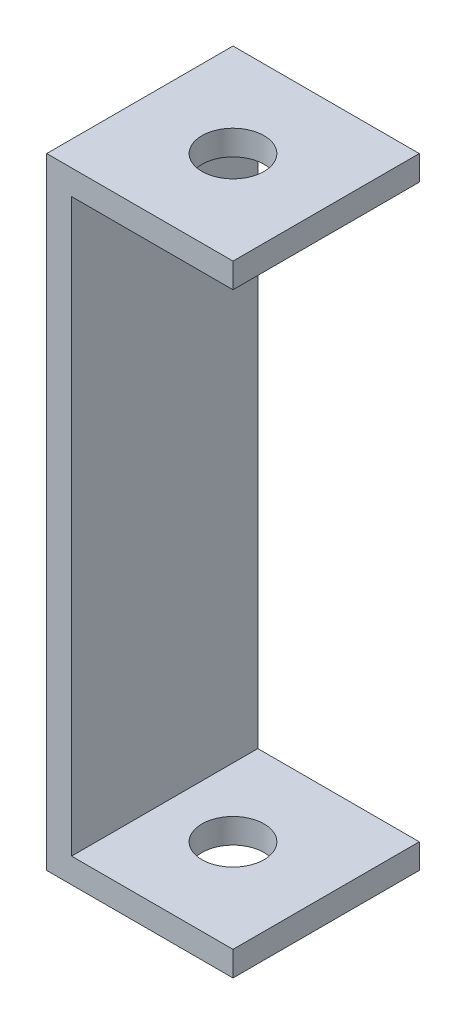
ISO-10303-21;
HEADER;
FILE_DESCRIPTION(('STEP AP214'),'2;1');
FILE_NAME('part.step','',(''),(''),'','','');
FILE_SCHEMA(('AUTOMOTIVE_DESIGN { 1 0 10303 214 1 1 1 1 }'));
ENDSEC;
DATA;
#1=APPLICATION_CONTEXT('core data for automotive mechanical design processes');
#2=APPLICATION_PROTOCOL_DEFINITION('international standard','automotive_design',2000,#1);
#3=PRODUCT_CONTEXT('',#1,'mechanical');
#4=PRODUCT('Part','Part','',(#3));
#5=PRODUCT_RELATED_PRODUCT_CATEGORY('part','',(#4));
#6=PRODUCT_DEFINITION_FORMATION('','',#4);
#7=PRODUCT_DEFINITION_CONTEXT('part definition',#1,'design');
#8=PRODUCT_DEFINITION('design','',#6,#7);
#9=PRODUCT_DEFINITION_SHAPE('','',#8);
#10=(LENGTH_UNIT() NAMED_UNIT(*) SI_UNIT(.MILLI.,.METRE.));
#11=(NAMED_UNIT(*) PLANE_ANGLE_UNIT() SI_UNIT($,.RADIAN.));
#12=(NAMED_UNIT(*) SI_UNIT($,.STERADIAN.) SOLID_ANGLE_UNIT());
#13=UNCERTAINTY_MEASURE_WITH_UNIT(LENGTH_MEASURE(1.E-05),#10,'distance_accuracy_value','');
#14=(GEOMETRIC_REPRESENTATION_CONTEXT(3) GLOBAL_UNCERTAINTY_ASSIGNED_CONTEXT((#13)) GLOBAL_UNIT_ASSIGNED_CONTEXT((#10,
#11,#12)) REPRESENTATION_CONTEXT('',''));
#15=CARTESIAN_POINT('',(0.,0.,0.));
#16=DIRECTION('',(0.,0.,1.));
#17=DIRECTION('',(1.,0.,0.));
#18=AXIS2_PLACEMENT_3D('',#15,#16,#17);
#19=CARTESIAN_POINT('',(15.,2.,15.));
#20=DIRECTION('',(-1.,0.,0.));
#21=DIRECTION('',(0.,0.,1.));
#22=AXIS2_PLACEMENT_3D('',#19,#20,#21);
#23=PLANE('',#22);
#24=DIRECTION('',(0.,1.,0.));
#25=VECTOR('',#24,1.);
#26=CARTESIAN_POINT('',(15.,2.,0.));
#27=LINE('',#26,#25);
#28=CARTESIAN_POINT('',(15.,0.,0.));
#29=VERTEX_POINT('',#28);
#30=CARTESIAN_POINT('',(15.,2.,0.));
#31=VERTEX_POINT('',#30);
#32=EDGE_CURVE('E144',#29,#31,#27,.T.);
#33=ORIENTED_EDGE('',*,*,#32,.T.);
#34=DIRECTION('',(0.,0.,-1.));
#35=VECTOR('',#34,1.);
#36=CARTESIAN_POINT('',(15.,2.,15.));
#37=LINE('',#36,#35);
#38=CARTESIAN_POINT('',(15.,2.,15.));
#39=VERTEX_POINT('',#38);
#40=EDGE_CURVE('E11',#39,#31,#37,.T.);
#41=ORIENTED_EDGE('',*,*,#40,.F.);
#42=DIRECTION('',(0.,1.,0.));
#43=VECTOR('',#42,1.);
#44=CARTESIAN_POINT('',(15.,2.,15.));
#45=LINE('',#44,#43);
#46=CARTESIAN_POINT('',(15.,0.,15.));
#47=VERTEX_POINT('',#46);
#48=EDGE_CURVE('E167',#47,#39,#45,.T.);
#49=ORIENTED_EDGE('',*,*,#48,.F.);
#50=DIRECTION('',(0.,0.,-1.));
#51=VECTOR('',#50,1.);
#52=CARTESIAN_POINT('',(15.,0.,15.));
#53=LINE('',#52,#51);
#54=EDGE_CURVE('E140',#47,#29,#53,.T.);
#55=ORIENTED_EDGE('',*,*,#54,.T.);
#56=EDGE_LOOP('',(#33,#41,#49,#55));
#57=FACE_BOUND('',#56,.T.);
#58=ADVANCED_FACE('F43',(#57),#23,.F.);
#59=CARTESIAN_POINT('',(2.00000000000001,2.,15.));
#60=DIRECTION('',(0.,-1.,0.));
#61=DIRECTION('',(1.,0.,0.));
#62=AXIS2_PLACEMENT_3D('',#59,#60,#61);
#63=PLANE('',#62);
#64=CARTESIAN_POINT('',(7.5,2.,7.5));
#65=DIRECTION('',(0.,-1.,0.));
#66=DIRECTION('',(1.,0.,0.));
#67=AXIS2_PLACEMENT_3D('',#64,#65,#66);
#68=CIRCLE('',#67,2.5);
#69=CARTESIAN_POINT('',(7.5,2.,10.));
#70=VERTEX_POINT('',#69);
#71=EDGE_CURVE('E149',#70,#70,#68,.T.);
#72=ORIENTED_EDGE('',*,*,#71,.T.);
#73=EDGE_LOOP('',(#72));
#74=FACE_BOUND('',#73,.T.);
#75=DIRECTION('',(-1.,0.,0.));
#76=VECTOR('',#75,1.);
#77=CARTESIAN_POINT('',(2.00000000000001,2.,0.));
#78=LINE('',#77,#76);
#79=CARTESIAN_POINT('',(2.00000000000001,2.,0.));
#80=VERTEX_POINT('',#79);
#81=EDGE_CURVE('E148',#31,#80,#78,.T.);
#82=ORIENTED_EDGE('',*,*,#81,.T.);
#83=DIRECTION('',(0.,0.,-1.));
#84=VECTOR('',#83,1.);
#85=CARTESIAN_POINT('',(2.00000000000001,2.,15.));
#86=LINE('',#85,#84);
#87=CARTESIAN_POINT('',(2.00000000000001,2.,15.));
#88=VERTEX_POINT('',#87);
#89=EDGE_CURVE('E52',#88,#80,#86,.T.);
#90=ORIENTED_EDGE('',*,*,#89,.F.);
#91=DIRECTION('',(-1.,0.,0.));
#92=VECTOR('',#91,1.);
#93=CARTESIAN_POINT('',(2.00000000000001,2.,15.));
#94=LINE('',#93,#92);
#95=EDGE_CURVE('E103',#39,#88,#94,.T.);
#96=ORIENTED_EDGE('',*,*,#95,.F.);
#97=ORIENTED_EDGE('',*,*,#40,.T.);
#98=EDGE_LOOP('',(#82,#90,#96,#97));
#99=FACE_BOUND('',#98,.T.);
#100=ADVANCED_FACE('F236',(#74,#99),#63,.F.);
#101=CARTESIAN_POINT('',(2.,48.,15.));
#102=DIRECTION('',(-1.,0.,0.));
#103=DIRECTION('',(0.,-1.,0.));
#104=AXIS2_PLACEMENT_3D('',#101,#102,#103);
#105=PLANE('',#104);
#106=DIRECTION('',(0.,1.,0.));
#107=VECTOR('',#106,1.);
#108=CARTESIAN_POINT('',(2.,48.,0.));
#109=LINE('',#108,#107);
#110=CARTESIAN_POINT('',(2.,48.,0.));
#111=VERTEX_POINT('',#110);
#112=EDGE_CURVE('E152',#80,#111,#109,.T.);
#113=ORIENTED_EDGE('',*,*,#112,.T.);
#114=DIRECTION('',(0.,0.,-1.));
#115=VECTOR('',#114,1.);
#116=CARTESIAN_POINT('',(2.,48.,15.));
#117=LINE('',#116,#115);
#118=CARTESIAN_POINT('',(2.,48.,15.));
#119=VERTEX_POINT('',#118);
#120=EDGE_CURVE('E178',#119,#111,#117,.T.);
#121=ORIENTED_EDGE('',*,*,#120,.F.);
#122=DIRECTION('',(0.,1.,0.));
#123=VECTOR('',#122,1.);
#124=CARTESIAN_POINT('',(2.,48.,15.));
#125=LINE('',#124,#123);
#126=EDGE_CURVE('E188',#88,#119,#125,.T.);
#127=ORIENTED_EDGE('',*,*,#126,.F.);
#128=ORIENTED_EDGE('',*,*,#89,.T.);
#129=EDGE_LOOP('',(#113,#121,#127,#128));
#130=FACE_BOUND('',#129,.T.);
#131=ADVANCED_FACE('F186',(#130),#105,.F.);
#132=CARTESIAN_POINT('',(15.,48.,15.));
#133=DIRECTION('',(0.,1.,0.));
#134=DIRECTION('',(0.,0.,1.));
#135=AXIS2_PLACEMENT_3D('',#132,#133,#134);
#136=PLANE('',#135);
#137=CARTESIAN_POINT('',(7.5,48.,7.5));
#138=DIRECTION('',(0.,1.,0.));
#139=DIRECTION('',(0.,0.,1.));
#140=AXIS2_PLACEMENT_3D('',#137,#138,#139);
#141=CIRCLE('',#140,2.5);
#142=CARTESIAN_POINT('',(7.5,48.,10.));
#143=VERTEX_POINT('',#142);
#144=EDGE_CURVE('E214',#143,#143,#141,.T.);
#145=ORIENTED_EDGE('',*,*,#144,.T.);
#146=EDGE_LOOP('',(#145));
#147=FACE_BOUND('',#146,.T.);
#148=DIRECTION('',(1.,0.,0.));
#149=VECTOR('',#148,1.);
#150=CARTESIAN_POINT('',(15.,48.,0.));
#151=LINE('',#150,#149);
#152=CARTESIAN_POINT('',(15.,48.,0.));
#153=VERTEX_POINT('',#152);
#154=EDGE_CURVE('E155',#111,#153,#151,.T.);
#155=ORIENTED_EDGE('',*,*,#154,.T.);
#156=DIRECTION('',(0.,0.,-1.));
#157=VECTOR('',#156,1.);
#158=CARTESIAN_POINT('',(15.,48.,15.));
#159=LINE('',#158,#157);
#160=CARTESIAN_POINT('',(15.,48.,15.));
#161=VERTEX_POINT('',#160);
#162=EDGE_CURVE('E174',#161,#153,#159,.T.);
#163=ORIENTED_EDGE('',*,*,#162,.F.);
#164=DIRECTION('',(1.,0.,0.));
#165=VECTOR('',#164,1.);
#166=CARTESIAN_POINT('',(15.,48.,15.));
#167=LINE('',#166,#165);
#168=EDGE_CURVE('E201',#119,#161,#167,.T.);
#169=ORIENTED_EDGE('',*,*,#168,.F.);
#170=ORIENTED_EDGE('',*,*,#120,.T.);
#171=EDGE_LOOP('',(#155,#163,#169,#170));
#172=FACE_BOUND('',#171,.T.);
#173=ADVANCED_FACE('F196',(#147,#172),#136,.F.);
#174=CARTESIAN_POINT('',(15.,50.,15.));
#175=DIRECTION('',(-1.,0.,0.));
#176=DIRECTION('',(0.,0.,1.));
#177=AXIS2_PLACEMENT_3D('',#174,#175,#176);
#178=PLANE('',#177);
#179=DIRECTION('',(0.,1.,0.));
#180=VECTOR('',#179,1.);
#181=CARTESIAN_POINT('',(15.,50.,0.));
#182=LINE('',#181,#180);
#183=CARTESIAN_POINT('',(15.,50.,0.));
#184=VERTEX_POINT('',#183);
#185=EDGE_CURVE('E158',#153,#184,#182,.T.);
#186=ORIENTED_EDGE('',*,*,#185,.T.);
#187=DIRECTION('',(0.,0.,-1.));
#188=VECTOR('',#187,1.);
#189=CARTESIAN_POINT('',(15.,50.,15.));
#190=LINE('',#189,#188);
#191=CARTESIAN_POINT('',(15.,50.,15.));
#192=VERTEX_POINT('',#191);
#193=EDGE_CURVE('E133',#192,#184,#190,.T.);
#194=ORIENTED_EDGE('',*,*,#193,.F.);
#195=DIRECTION('',(0.,1.,0.));
#196=VECTOR('',#195,1.);
#197=CARTESIAN_POINT('',(15.,50.,15.));
#198=LINE('',#197,#196);
#199=EDGE_CURVE('E122',#161,#192,#198,.T.);
#200=ORIENTED_EDGE('',*,*,#199,.F.);
#201=ORIENTED_EDGE('',*,*,#162,.T.);
#202=EDGE_LOOP('',(#186,#194,#200,#201));
#203=FACE_BOUND('',#202,.T.);
#204=ADVANCED_FACE('F199',(#203),#178,.F.);
#205=CARTESIAN_POINT('',(0.,50.,15.));
#206=DIRECTION('',(0.,-1.,0.));
#207=DIRECTION('',(0.,0.,-1.));
#208=AXIS2_PLACEMENT_3D('',#205,#206,#207);
#209=PLANE('',#208);
#210=CARTESIAN_POINT('',(7.5,50.,7.5));
#211=DIRECTION('',(0.,1.,0.));
#212=DIRECTION('',(0.,0.,1.));
#213=AXIS2_PLACEMENT_3D('',#210,#211,#212);
#214=CIRCLE('',#213,2.5);
#215=CARTESIAN_POINT('',(7.5,50.,10.));
#216=VERTEX_POINT('',#215);
#217=EDGE_CURVE('E219',#216,#216,#214,.T.);
#218=ORIENTED_EDGE('',*,*,#217,.F.);
#219=EDGE_LOOP('',(#218));
#220=FACE_BOUND('',#219,.T.);
#221=DIRECTION('',(-1.,0.,0.));
#222=VECTOR('',#221,1.);
#223=CARTESIAN_POINT('',(0.,50.,0.));
#224=LINE('',#223,#222);
#225=CARTESIAN_POINT('',(0.,50.,0.));
#226=VERTEX_POINT('',#225);
#227=EDGE_CURVE('E131',#184,#226,#224,.T.);
#228=ORIENTED_EDGE('',*,*,#227,.T.);
#229=DIRECTION('',(0.,0.,-1.));
#230=VECTOR('',#229,1.);
#231=CARTESIAN_POINT('',(0.,50.,15.));
#232=LINE('',#231,#230);
#233=CARTESIAN_POINT('',(0.,50.,15.));
#234=VERTEX_POINT('',#233);
#235=EDGE_CURVE('E128',#234,#226,#232,.T.);
#236=ORIENTED_EDGE('',*,*,#235,.F.);
#237=DIRECTION('',(-1.,0.,0.));
#238=VECTOR('',#237,1.);
#239=CARTESIAN_POINT('',(0.,50.,15.));
#240=LINE('',#239,#238);
#241=EDGE_CURVE('E116',#192,#234,#240,.T.);
#242=ORIENTED_EDGE('',*,*,#241,.F.);
#243=ORIENTED_EDGE('',*,*,#193,.T.);
#244=EDGE_LOOP('',(#228,#236,#242,#243));
#245=FACE_BOUND('',#244,.T.);
#246=ADVANCED_FACE('F129',(#220,#245),#209,.F.);
#247=CARTESIAN_POINT('',(0.,0.,15.));
#248=DIRECTION('',(1.,0.,0.));
#249=DIRECTION('',(0.,0.,-1.));
#250=AXIS2_PLACEMENT_3D('',#247,#248,#249);
#251=PLANE('',#250);
#252=DIRECTION('',(0.,-1.,0.));
#253=VECTOR('',#252,1.);
#254=CARTESIAN_POINT('',(0.,0.,0.));
#255=LINE('',#254,#253);
#256=CARTESIAN_POINT('',(0.,0.,0.));
#257=VERTEX_POINT('',#256);
#258=EDGE_CURVE('E89',#226,#257,#255,.T.);
#259=ORIENTED_EDGE('',*,*,#258,.T.);
#260=DIRECTION('',(0.,0.,-1.));
#261=VECTOR('',#260,1.);
#262=CARTESIAN_POINT('',(0.,0.,15.));
#263=LINE('',#262,#261);
#264=CARTESIAN_POINT('',(0.,0.,15.));
#265=VERTEX_POINT('',#264);
#266=EDGE_CURVE('E134',#265,#257,#263,.T.);
#267=ORIENTED_EDGE('',*,*,#266,.F.);
#268=DIRECTION('',(0.,-1.,0.));
#269=VECTOR('',#268,1.);
#270=CARTESIAN_POINT('',(0.,0.,15.));
#271=LINE('',#270,#269);
#272=EDGE_CURVE('E120',#234,#265,#271,.T.);
#273=ORIENTED_EDGE('',*,*,#272,.F.);
#274=ORIENTED_EDGE('',*,*,#235,.T.);
#275=EDGE_LOOP('',(#259,#267,#273,#274));
#276=FACE_BOUND('',#275,.T.);
#277=ADVANCED_FACE('F136',(#276),#251,.F.);
#278=CARTESIAN_POINT('',(15.,0.,15.));
#279=DIRECTION('',(0.,1.,0.));
#280=DIRECTION('',(-1.,0.,0.));
#281=AXIS2_PLACEMENT_3D('',#278,#279,#280);
#282=PLANE('',#281);
#283=CARTESIAN_POINT('',(7.5,0.,7.5));
#284=DIRECTION('',(0.,1.,0.));
#285=DIRECTION('',(0.,0.,1.));
#286=AXIS2_PLACEMENT_3D('',#283,#284,#285);
#287=CIRCLE('',#286,2.5);
#288=CARTESIAN_POINT('',(7.5,0.,10.));
#289=VERTEX_POINT('',#288);
#290=EDGE_CURVE('E218',#289,#289,#287,.T.);
#291=ORIENTED_EDGE('',*,*,#290,.T.);
#292=EDGE_LOOP('',(#291));
#293=FACE_BOUND('',#292,.T.);
#294=DIRECTION('',(1.,0.,0.));
#295=VECTOR('',#294,1.);
#296=CARTESIAN_POINT('',(15.,0.,0.));
#297=LINE('',#296,#295);
#298=EDGE_CURVE('E95',#257,#29,#297,.T.);
#299=ORIENTED_EDGE('',*,*,#298,.T.);
#300=ORIENTED_EDGE('',*,*,#54,.F.);
#301=DIRECTION('',(1.,0.,0.));
#302=VECTOR('',#301,1.);
#303=CARTESIAN_POINT('',(15.,0.,15.));
#304=LINE('',#303,#302);
#305=EDGE_CURVE('E60',#265,#47,#304,.T.);
#306=ORIENTED_EDGE('',*,*,#305,.F.);
#307=ORIENTED_EDGE('',*,*,#266,.T.);
#308=EDGE_LOOP('',(#299,#300,#306,#307));
#309=FACE_BOUND('',#308,.T.);
#310=ADVANCED_FACE('F227',(#293,#309),#282,.F.);
#311=CARTESIAN_POINT('',(0.,0.,15.));
#312=DIRECTION('',(0.,0.,-1.));
#313=DIRECTION('',(-1.,0.,0.));
#314=AXIS2_PLACEMENT_3D('',#311,#312,#313);
#315=PLANE('',#314);
#316=ORIENTED_EDGE('',*,*,#48,.T.);
#317=ORIENTED_EDGE('',*,*,#95,.T.);
#318=ORIENTED_EDGE('',*,*,#126,.T.);
#319=ORIENTED_EDGE('',*,*,#168,.T.);
#320=ORIENTED_EDGE('',*,*,#199,.T.);
#321=ORIENTED_EDGE('',*,*,#241,.T.);
#322=ORIENTED_EDGE('',*,*,#272,.T.);
#323=ORIENTED_EDGE('',*,*,#305,.T.);
#324=EDGE_LOOP('',(#316,#317,#318,#319,#320,#321,#322,#323));
#325=FACE_BOUND('',#324,.T.);
#326=ADVANCED_FACE('F118',(#325),#315,.F.);
#327=CARTESIAN_POINT('',(0.,0.,0.));
#328=DIRECTION('',(0.,0.,-1.));
#329=DIRECTION('',(-1.,0.,0.));
#330=AXIS2_PLACEMENT_3D('',#327,#328,#329);
#331=PLANE('',#330);
#332=ORIENTED_EDGE('',*,*,#32,.F.);
#333=ORIENTED_EDGE('',*,*,#298,.F.);
#334=ORIENTED_EDGE('',*,*,#258,.F.);
#335=ORIENTED_EDGE('',*,*,#227,.F.);
#336=ORIENTED_EDGE('',*,*,#185,.F.);
#337=ORIENTED_EDGE('',*,*,#154,.F.);
#338=ORIENTED_EDGE('',*,*,#112,.F.);
#339=ORIENTED_EDGE('',*,*,#81,.F.);
#340=EDGE_LOOP('',(#332,#333,#334,#335,#336,#337,#338,#339));
#341=FACE_BOUND('',#340,.T.);
#342=ADVANCED_FACE('F192',(#341),#331,.T.);
#343=CARTESIAN_POINT('',(7.5,0.,7.5));
#344=DIRECTION('',(0.,1.,0.));
#345=DIRECTION('',(0.,0.,1.));
#346=AXIS2_PLACEMENT_3D('',#343,#344,#345);
#347=CYLINDRICAL_SURFACE('',#346,2.5);
#348=CARTESIAN_POINT('',(7.5,0.,10.));
#349=CARTESIAN_POINT('',(7.5,0.0208333333333334,10.));
#350=CARTESIAN_POINT('',(7.5,0.0416666666666667,10.));
#351=CARTESIAN_POINT('',(7.5,0.0833333333333334,10.));
#352=CARTESIAN_POINT('',(7.5,0.104166666666667,10.));
#353=CARTESIAN_POINT('',(7.5,0.145833333333333,10.));
#354=CARTESIAN_POINT('',(7.5,0.166666666666667,10.));
#355=CARTESIAN_POINT('',(7.5,0.208333333333333,10.));
#356=CARTESIAN_POINT('',(7.5,0.229166666666667,10.));
#357=CARTESIAN_POINT('',(7.5,0.270833333333334,10.));
#358=CARTESIAN_POINT('',(7.5,0.291666666666667,10.));
#359=CARTESIAN_POINT('',(7.5,0.333333333333334,10.));
#360=CARTESIAN_POINT('',(7.5,0.354166666666667,10.));
#361=CARTESIAN_POINT('',(7.5,0.395833333333334,10.));
#362=CARTESIAN_POINT('',(7.5,0.416666666666667,10.));
#363=CARTESIAN_POINT('',(7.5,0.458333333333334,10.));
#364=CARTESIAN_POINT('',(7.5,0.479166666666667,10.));
#365=CARTESIAN_POINT('',(7.5,0.520833333333334,10.));
#366=CARTESIAN_POINT('',(7.5,0.541666666666667,10.));
#367=CARTESIAN_POINT('',(7.5,0.583333333333334,10.));
#368=CARTESIAN_POINT('',(7.5,0.604166666666667,10.));
#369=CARTESIAN_POINT('',(7.5,0.645833333333334,10.));
#370=CARTESIAN_POINT('',(7.5,0.666666666666667,10.));
#371=CARTESIAN_POINT('',(7.5,0.708333333333334,10.));
#372=CARTESIAN_POINT('',(7.5,0.729166666666667,10.));
#373=CARTESIAN_POINT('',(7.5,0.770833333333334,10.));
#374=CARTESIAN_POINT('',(7.5,0.791666666666667,10.));
#375=CARTESIAN_POINT('',(7.5,0.833333333333334,10.));
#376=CARTESIAN_POINT('',(7.5,0.854166666666667,10.));
#377=CARTESIAN_POINT('',(7.5,0.895833333333334,10.));
#378=CARTESIAN_POINT('',(7.5,0.916666666666667,10.));
#379=CARTESIAN_POINT('',(7.5,0.958333333333334,10.));
#380=CARTESIAN_POINT('',(7.5,0.979166666666667,10.));
#381=CARTESIAN_POINT('',(7.5,1.02083333333333,10.));
#382=CARTESIAN_POINT('',(7.5,1.04166666666667,10.));
#383=CARTESIAN_POINT('',(7.5,1.08333333333333,10.));
#384=CARTESIAN_POINT('',(7.5,1.10416666666667,10.));
#385=CARTESIAN_POINT('',(7.5,1.14583333333333,10.));
#386=CARTESIAN_POINT('',(7.5,1.16666666666667,10.));
#387=CARTESIAN_POINT('',(7.5,1.20833333333333,10.));
#388=CARTESIAN_POINT('',(7.5,1.22916666666667,10.));
#389=CARTESIAN_POINT('',(7.5,1.27083333333333,10.));
#390=CARTESIAN_POINT('',(7.5,1.29166666666667,10.));
#391=CARTESIAN_POINT('',(7.5,1.33333333333333,10.));
#392=CARTESIAN_POINT('',(7.5,1.35416666666667,10.));
#393=CARTESIAN_POINT('',(7.5,1.39583333333333,10.));
#394=CARTESIAN_POINT('',(7.5,1.41666666666667,10.));
#395=CARTESIAN_POINT('',(7.5,1.45833333333333,10.));
#396=CARTESIAN_POINT('',(7.5,1.47916666666667,10.));
#397=CARTESIAN_POINT('',(7.5,1.52083333333333,10.));
#398=CARTESIAN_POINT('',(7.5,1.54166666666667,10.));
#399=CARTESIAN_POINT('',(7.5,1.58333333333333,10.));
#400=CARTESIAN_POINT('',(7.5,1.60416666666667,10.));
#401=CARTESIAN_POINT('',(7.5,1.64583333333333,10.));
#402=CARTESIAN_POINT('',(7.5,1.66666666666667,10.));
#403=CARTESIAN_POINT('',(7.5,1.70833333333333,10.));
#404=CARTESIAN_POINT('',(7.5,1.72916666666667,10.));
#405=CARTESIAN_POINT('',(7.5,1.77083333333333,10.));
#406=CARTESIAN_POINT('',(7.5,1.79166666666667,10.));
#407=CARTESIAN_POINT('',(7.5,1.83333333333333,10.));
#408=CARTESIAN_POINT('',(7.5,1.85416666666667,10.));
#409=CARTESIAN_POINT('',(7.5,1.89583333333333,10.));
#410=CARTESIAN_POINT('',(7.5,1.91666666666667,10.));
#411=CARTESIAN_POINT('',(7.5,1.95833333333334,10.));
#412=CARTESIAN_POINT('',(7.5,1.97916666666667,10.));
#413=CARTESIAN_POINT('',(7.5,2.,10.));
#414=B_SPLINE_CURVE_WITH_KNOTS('',3,(#348,#349,#350,#351,#352,#353,#354,#355,#356,#357,#358,
#359,#360,#361,#362,#363,#364,#365,#366,#367,#368,#369,#370,#371,#372,#373,#374,#375,#376,#377,
#378,#379,#380,#381,#382,#383,#384,#385,#386,#387,#388,#389,#390,#391,#392,#393,#394,#395,#396,
#397,#398,#399,#400,#401,#402,#403,#404,#405,#406,#407,#408,#409,#410,#411,#412,#413),
.UNSPECIFIED.,.F.,.F.,(4,2,2,2,2,2,2,2,2,2,2,2,2,2,2,2,2,2,2,2,2,2,2,2,2,2,2,2,2,2,2,2,4),(0.,
0.0625,0.125,0.1875,0.25,0.3125,0.375,0.4375,0.5,0.5625,0.625,0.687500000000001,
0.750000000000001,0.812500000000001,0.875000000000001,0.937500000000001,1.,1.0625,1.125,1.1875,
1.25,1.3125,1.375,1.4375,1.5,1.5625,1.625,1.6875,1.75,1.8125,1.875,1.9375,2.),.UNSPECIFIED.);
#415=EDGE_CURVE('BSEAM229',#289,#70,#414,.T.);
#416=ORIENTED_EDGE('',*,*,#290,.F.);
#417=ORIENTED_EDGE('',*,*,#71,.F.);
#418=ORIENTED_EDGE('',*,*,#415,.T.);
#419=ORIENTED_EDGE('',*,*,#415,.F.);
#420=EDGE_LOOP('',(#416,#418,#417,#419));
#421=FACE_BOUND('',#420,.T.);
#422=ADVANCED_FACE('F229',(#421),#347,.F.);
#423=CARTESIAN_POINT('',(7.5,50.,10.));
#424=CARTESIAN_POINT('',(7.5,49.9791666666667,10.));
#425=CARTESIAN_POINT('',(7.5,49.9583333333333,10.));
#426=CARTESIAN_POINT('',(7.5,49.9166666666667,10.));
#427=CARTESIAN_POINT('',(7.5,49.8958333333333,10.));
#428=CARTESIAN_POINT('',(7.5,49.8541666666667,10.));
#429=CARTESIAN_POINT('',(7.5,49.8333333333333,10.));
#430=CARTESIAN_POINT('',(7.5,49.7916666666667,10.));
#431=CARTESIAN_POINT('',(7.5,49.7708333333333,10.));
#432=CARTESIAN_POINT('',(7.5,49.7291666666667,10.));
#433=CARTESIAN_POINT('',(7.5,49.7083333333333,10.));
#434=CARTESIAN_POINT('',(7.5,49.6666666666667,10.));
#435=CARTESIAN_POINT('',(7.5,49.6458333333333,10.));
#436=CARTESIAN_POINT('',(7.5,49.6041666666667,10.));
#437=CARTESIAN_POINT('',(7.5,49.5833333333333,10.));
#438=CARTESIAN_POINT('',(7.5,49.5416666666667,10.));
#439=CARTESIAN_POINT('',(7.5,49.5208333333333,10.));
#440=CARTESIAN_POINT('',(7.5,49.4791666666667,10.));
#441=CARTESIAN_POINT('',(7.5,49.4583333333333,10.));
#442=CARTESIAN_POINT('',(7.5,49.4166666666667,10.));
#443=CARTESIAN_POINT('',(7.5,49.3958333333333,10.));
#444=CARTESIAN_POINT('',(7.5,49.3541666666667,10.));
#445=CARTESIAN_POINT('',(7.5,49.3333333333333,10.));
#446=CARTESIAN_POINT('',(7.5,49.2916666666667,10.));
#447=CARTESIAN_POINT('',(7.5,49.2708333333333,10.));
#448=CARTESIAN_POINT('',(7.5,49.2291666666667,10.));
#449=CARTESIAN_POINT('',(7.5,49.2083333333333,10.));
#450=CARTESIAN_POINT('',(7.5,49.1666666666667,10.));
#451=CARTESIAN_POINT('',(7.5,49.1458333333333,10.));
#452=CARTESIAN_POINT('',(7.5,49.1041666666667,10.));
#453=CARTESIAN_POINT('',(7.5,49.0833333333333,10.));
#454=CARTESIAN_POINT('',(7.5,49.0416666666667,10.));
#455=CARTESIAN_POINT('',(7.5,49.0208333333333,10.));
#456=CARTESIAN_POINT('',(7.5,48.9791666666667,10.));
#457=CARTESIAN_POINT('',(7.5,48.9583333333333,10.));
#458=CARTESIAN_POINT('',(7.5,48.9166666666667,10.));
#459=CARTESIAN_POINT('',(7.5,48.8958333333333,10.));
#460=CARTESIAN_POINT('',(7.5,48.8541666666667,10.));
#461=CARTESIAN_POINT('',(7.5,48.8333333333333,10.));
#462=CARTESIAN_POINT('',(7.5,48.7916666666667,10.));
#463=CARTESIAN_POINT('',(7.5,48.7708333333333,10.));
#464=CARTESIAN_POINT('',(7.5,48.7291666666667,10.));
#465=CARTESIAN_POINT('',(7.5,48.7083333333333,10.));
#466=CARTESIAN_POINT('',(7.5,48.6666666666667,10.));
#467=CARTESIAN_POINT('',(7.5,48.6458333333333,10.));
#468=CARTESIAN_POINT('',(7.5,48.6041666666667,10.));
#469=CARTESIAN_POINT('',(7.5,48.5833333333333,10.));
#470=CARTESIAN_POINT('',(7.5,48.5416666666667,10.));
#471=CARTESIAN_POINT('',(7.5,48.5208333333333,10.));
#472=CARTESIAN_POINT('',(7.5,48.4791666666667,10.));
#473=CARTESIAN_POINT('',(7.5,48.4583333333333,10.));
#474=CARTESIAN_POINT('',(7.5,48.4166666666667,10.));
#475=CARTESIAN_POINT('',(7.5,48.3958333333333,10.));
#476=CARTESIAN_POINT('',(7.5,48.3541666666667,10.));
#477=CARTESIAN_POINT('',(7.5,48.3333333333333,10.));
#478=CARTESIAN_POINT('',(7.5,48.2916666666667,10.));
#479=CARTESIAN_POINT('',(7.5,48.2708333333333,10.));
#480=CARTESIAN_POINT('',(7.5,48.2291666666667,10.));
#481=CARTESIAN_POINT('',(7.5,48.2083333333333,10.));
#482=CARTESIAN_POINT('',(7.5,48.1666666666667,10.));
#483=CARTESIAN_POINT('',(7.5,48.1458333333333,10.));
#484=CARTESIAN_POINT('',(7.5,48.1041666666667,10.));
#485=CARTESIAN_POINT('',(7.5,48.0833333333333,10.));
#486=CARTESIAN_POINT('',(7.5,48.0416666666667,10.));
#487=CARTESIAN_POINT('',(7.5,48.0208333333333,10.));
#488=CARTESIAN_POINT('',(7.5,48.,10.));
#489=B_SPLINE_CURVE_WITH_KNOTS('',3,(#423,#424,#425,#426,#427,#428,#429,#430,#431,#432,#433,
#434,#435,#436,#437,#438,#439,#440,#441,#442,#443,#444,#445,#446,#447,#448,#449,#450,#451,#452,
#453,#454,#455,#456,#457,#458,#459,#460,#461,#462,#463,#464,#465,#466,#467,#468,#469,#470,#471,
#472,#473,#474,#475,#476,#477,#478,#479,#480,#481,#482,#483,#484,#485,#486,#487,#488),
.UNSPECIFIED.,.F.,.F.,(4,2,2,2,2,2,2,2,2,2,2,2,2,2,2,2,2,2,2,2,2,2,2,2,2,2,2,2,2,2,2,2,4),(0.,
0.0625000000000001,0.125,0.1875,0.25,0.3125,0.375,0.4375,0.5,0.5625,0.625000000000001,
0.687500000000001,0.750000000000001,0.812500000000001,0.875000000000001,0.937500000000001,1.,
1.0625,1.125,1.1875,1.25,1.3125,1.375,1.4375,1.5,1.5625,1.625,1.6875,1.75,1.8125,1.875,1.9375,
2.),.UNSPECIFIED.);
#490=EDGE_CURVE('BSEAM232',#216,#143,#489,.T.);
#491=ORIENTED_EDGE('',*,*,#217,.T.);
#492=ORIENTED_EDGE('',*,*,#144,.F.);
#493=ORIENTED_EDGE('',*,*,#490,.T.);
#494=ORIENTED_EDGE('',*,*,#490,.F.);
#495=EDGE_LOOP('',(#491,#493,#492,#494));
#496=FACE_BOUND('',#495,.T.);
#497=ADVANCED_FACE('F232',(#496),#347,.F.);
#498=CLOSED_SHELL('',(#58,#100,#131,#173,#204,#246,#277,#310,#326,#342,#422,#497));
#499=MANIFOLD_SOLID_BREP('B2',#498);
#500=ADVANCED_BREP_SHAPE_REPRESENTATION('',(#18,#499),#14);
#501=SHAPE_DEFINITION_REPRESENTATION(#9,#500);
ENDSEC;
END-ISO-10303-21;
